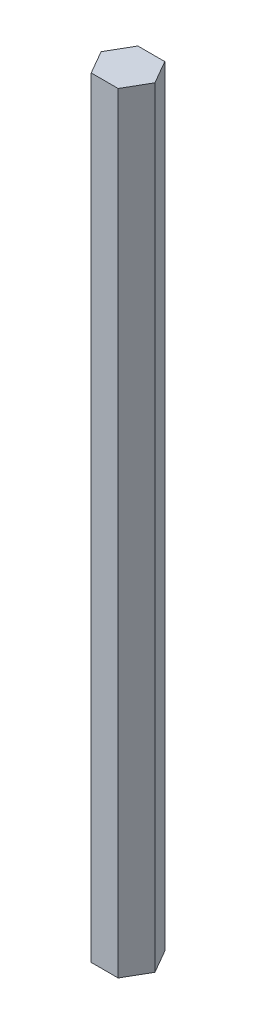
ISO-10303-21;
HEADER;
FILE_DESCRIPTION(('STEP AP214'),'2;1');
FILE_NAME('part.step','',(''),(''),'','','');
FILE_SCHEMA(('AUTOMOTIVE_DESIGN { 1 0 10303 214 1 1 1 1 }'));
ENDSEC;
DATA;
#1=APPLICATION_CONTEXT('core data for automotive mechanical design processes');
#2=APPLICATION_PROTOCOL_DEFINITION('international standard','automotive_design',2000,#1);
#3=PRODUCT_CONTEXT('',#1,'mechanical');
#4=PRODUCT('Part','Part','',(#3));
#5=PRODUCT_RELATED_PRODUCT_CATEGORY('part','',(#4));
#6=PRODUCT_DEFINITION_FORMATION('','',#4);
#7=PRODUCT_DEFINITION_CONTEXT('part definition',#1,'design');
#8=PRODUCT_DEFINITION('design','',#6,#7);
#9=PRODUCT_DEFINITION_SHAPE('','',#8);
#10=(LENGTH_UNIT() NAMED_UNIT(*) SI_UNIT(.MILLI.,.METRE.));
#11=(NAMED_UNIT(*) PLANE_ANGLE_UNIT() SI_UNIT($,.RADIAN.));
#12=(NAMED_UNIT(*) SI_UNIT($,.STERADIAN.) SOLID_ANGLE_UNIT());
#13=UNCERTAINTY_MEASURE_WITH_UNIT(LENGTH_MEASURE(1.E-05),#10,'distance_accuracy_value','');
#14=(GEOMETRIC_REPRESENTATION_CONTEXT(3) GLOBAL_UNCERTAINTY_ASSIGNED_CONTEXT((#13)) GLOBAL_UNIT_ASSIGNED_CONTEXT((#10,
#11,#12)) REPRESENTATION_CONTEXT('',''));
#15=CARTESIAN_POINT('',(0.,0.,0.));
#16=DIRECTION('',(0.,0.,1.));
#17=DIRECTION('',(1.,0.,0.));
#18=AXIS2_PLACEMENT_3D('',#15,#16,#17);
#19=CARTESIAN_POINT('',(4.195,-120.,0.));
#20=DIRECTION('',(0.866025403784438,0.,-0.5));
#21=DIRECTION('',(-0.5,0.,-0.866025403784439));
#22=AXIS2_PLACEMENT_3D('',#19,#20,#21);
#23=PLANE('',#22);
#24=DIRECTION('',(-0.5,0.,-0.866025403784439));
#25=VECTOR('',#24,1.);
#26=CARTESIAN_POINT('',(4.195,0.,0.));
#27=LINE('',#26,#25);
#28=CARTESIAN_POINT('',(4.195,0.,0.));
#29=VERTEX_POINT('',#28);
#30=CARTESIAN_POINT('',(2.0975,0.,-3.63297656887572));
#31=VERTEX_POINT('',#30);
#32=EDGE_CURVE('E130',#29,#31,#27,.T.);
#33=ORIENTED_EDGE('',*,*,#32,.F.);
#34=DIRECTION('',(0.,1.,0.));
#35=VECTOR('',#34,1.);
#36=CARTESIAN_POINT('',(4.195,-120.,0.));
#37=LINE('',#36,#35);
#38=CARTESIAN_POINT('',(4.195,-120.,0.));
#39=VERTEX_POINT('',#38);
#40=EDGE_CURVE('E11',#39,#29,#37,.T.);
#41=ORIENTED_EDGE('',*,*,#40,.F.);
#42=DIRECTION('',(-0.5,0.,-0.866025403784439));
#43=VECTOR('',#42,1.);
#44=CARTESIAN_POINT('',(4.195,-120.,0.));
#45=LINE('',#44,#43);
#46=CARTESIAN_POINT('',(2.0975,-120.,-3.63297656887572));
#47=VERTEX_POINT('',#46);
#48=EDGE_CURVE('E150',#39,#47,#45,.T.);
#49=ORIENTED_EDGE('',*,*,#48,.T.);
#50=DIRECTION('',(0.,1.,0.));
#51=VECTOR('',#50,1.);
#52=CARTESIAN_POINT('',(2.0975,-120.,-3.63297656887572));
#53=LINE('',#52,#51);
#54=EDGE_CURVE('E42',#47,#31,#53,.T.);
#55=ORIENTED_EDGE('',*,*,#54,.T.);
#56=EDGE_LOOP('',(#33,#41,#49,#55));
#57=FACE_BOUND('',#56,.T.);
#58=ADVANCED_FACE('F39',(#57),#23,.T.);
#59=CARTESIAN_POINT('',(2.0975,-120.,3.63297656887572));
#60=DIRECTION('',(0.866025403784438,0.,0.5));
#61=DIRECTION('',(0.5,0.,-0.866025403784439));
#62=AXIS2_PLACEMENT_3D('',#59,#60,#61);
#63=PLANE('',#62);
#64=DIRECTION('',(0.5,0.,-0.866025403784438));
#65=VECTOR('',#64,1.);
#66=CARTESIAN_POINT('',(2.0975,0.,3.63297656887572));
#67=LINE('',#66,#65);
#68=CARTESIAN_POINT('',(2.0975,0.,3.63297656887572));
#69=VERTEX_POINT('',#68);
#70=EDGE_CURVE('E147',#69,#29,#67,.T.);
#71=ORIENTED_EDGE('',*,*,#70,.F.);
#72=DIRECTION('',(0.,1.,0.));
#73=VECTOR('',#72,1.);
#74=CARTESIAN_POINT('',(2.0975,-120.,3.63297656887572));
#75=LINE('',#74,#73);
#76=CARTESIAN_POINT('',(2.0975,-120.,3.63297656887572));
#77=VERTEX_POINT('',#76);
#78=EDGE_CURVE('E49',#77,#69,#75,.T.);
#79=ORIENTED_EDGE('',*,*,#78,.F.);
#80=DIRECTION('',(0.5,0.,-0.866025403784438));
#81=VECTOR('',#80,1.);
#82=CARTESIAN_POINT('',(2.0975,-120.,3.63297656887572));
#83=LINE('',#82,#81);
#84=EDGE_CURVE('E116',#77,#39,#83,.T.);
#85=ORIENTED_EDGE('',*,*,#84,.T.);
#86=ORIENTED_EDGE('',*,*,#40,.T.);
#87=EDGE_LOOP('',(#71,#79,#85,#86));
#88=FACE_BOUND('',#87,.T.);
#89=ADVANCED_FACE('F162',(#88),#63,.T.);
#90=CARTESIAN_POINT('',(-2.0975,-120.,3.63297656887572));
#91=DIRECTION('',(0.,0.,1.));
#92=DIRECTION('',(1.,0.,0.));
#93=AXIS2_PLACEMENT_3D('',#90,#91,#92);
#94=PLANE('',#93);
#95=DIRECTION('',(1.,0.,0.));
#96=VECTOR('',#95,1.);
#97=CARTESIAN_POINT('',(-2.0975,0.,3.63297656887572));
#98=LINE('',#97,#96);
#99=CARTESIAN_POINT('',(-2.0975,0.,3.63297656887572));
#100=VERTEX_POINT('',#99);
#101=EDGE_CURVE('E102',#100,#69,#98,.T.);
#102=ORIENTED_EDGE('',*,*,#101,.F.);
#103=DIRECTION('',(0.,1.,0.));
#104=VECTOR('',#103,1.);
#105=CARTESIAN_POINT('',(-2.0975,-120.,3.63297656887572));
#106=LINE('',#105,#104);
#107=CARTESIAN_POINT('',(-2.0975,-120.,3.63297656887572));
#108=VERTEX_POINT('',#107);
#109=EDGE_CURVE('E97',#108,#100,#106,.T.);
#110=ORIENTED_EDGE('',*,*,#109,.F.);
#111=DIRECTION('',(1.,0.,0.));
#112=VECTOR('',#111,1.);
#113=CARTESIAN_POINT('',(-2.0975,-120.,3.63297656887572));
#114=LINE('',#113,#112);
#115=EDGE_CURVE('E100',#108,#77,#114,.T.);
#116=ORIENTED_EDGE('',*,*,#115,.T.);
#117=ORIENTED_EDGE('',*,*,#78,.T.);
#118=EDGE_LOOP('',(#102,#110,#116,#117));
#119=FACE_BOUND('',#118,.T.);
#120=ADVANCED_FACE('F99',(#119),#94,.T.);
#121=CARTESIAN_POINT('',(-4.195,-120.,0.));
#122=DIRECTION('',(-0.866025403784439,0.,0.5));
#123=DIRECTION('',(0.5,0.,0.866025403784439));
#124=AXIS2_PLACEMENT_3D('',#121,#122,#123);
#125=PLANE('',#124);
#126=DIRECTION('',(0.5,0.,0.866025403784439));
#127=VECTOR('',#126,1.);
#128=CARTESIAN_POINT('',(-4.195,0.,0.));
#129=LINE('',#128,#127);
#130=CARTESIAN_POINT('',(-4.195,0.,0.));
#131=VERTEX_POINT('',#130);
#132=EDGE_CURVE('E142',#131,#100,#129,.T.);
#133=ORIENTED_EDGE('',*,*,#132,.F.);
#134=DIRECTION('',(0.,1.,0.));
#135=VECTOR('',#134,1.);
#136=CARTESIAN_POINT('',(-4.195,-120.,0.));
#137=LINE('',#136,#135);
#138=CARTESIAN_POINT('',(-4.195,-120.,0.));
#139=VERTEX_POINT('',#138);
#140=EDGE_CURVE('E108',#139,#131,#137,.T.);
#141=ORIENTED_EDGE('',*,*,#140,.F.);
#142=DIRECTION('',(0.5,0.,0.866025403784439));
#143=VECTOR('',#142,1.);
#144=CARTESIAN_POINT('',(-4.195,-120.,0.));
#145=LINE('',#144,#143);
#146=EDGE_CURVE('E114',#139,#108,#145,.T.);
#147=ORIENTED_EDGE('',*,*,#146,.T.);
#148=ORIENTED_EDGE('',*,*,#109,.T.);
#149=EDGE_LOOP('',(#133,#141,#147,#148));
#150=FACE_BOUND('',#149,.T.);
#151=ADVANCED_FACE('F119',(#150),#125,.T.);
#152=CARTESIAN_POINT('',(-2.0975,-120.,-3.63297656887572));
#153=DIRECTION('',(-0.866025403784439,0.,-0.5));
#154=DIRECTION('',(-0.5,0.,0.866025403784439));
#155=AXIS2_PLACEMENT_3D('',#152,#153,#154);
#156=PLANE('',#155);
#157=DIRECTION('',(-0.5,0.,0.866025403784439));
#158=VECTOR('',#157,1.);
#159=CARTESIAN_POINT('',(-2.0975,0.,-3.63297656887572));
#160=LINE('',#159,#158);
#161=CARTESIAN_POINT('',(-2.0975,0.,-3.63297656887572));
#162=VERTEX_POINT('',#161);
#163=EDGE_CURVE('E138',#162,#131,#160,.T.);
#164=ORIENTED_EDGE('',*,*,#163,.F.);
#165=DIRECTION('',(0.,1.,0.));
#166=VECTOR('',#165,1.);
#167=CARTESIAN_POINT('',(-2.0975,-120.,-3.63297656887572));
#168=LINE('',#167,#166);
#169=CARTESIAN_POINT('',(-2.0975,-120.,-3.63297656887572));
#170=VERTEX_POINT('',#169);
#171=EDGE_CURVE('E155',#170,#162,#168,.T.);
#172=ORIENTED_EDGE('',*,*,#171,.F.);
#173=DIRECTION('',(-0.5,0.,0.866025403784439));
#174=VECTOR('',#173,1.);
#175=CARTESIAN_POINT('',(-2.0975,-120.,-3.63297656887572));
#176=LINE('',#175,#174);
#177=EDGE_CURVE('E121',#170,#139,#176,.T.);
#178=ORIENTED_EDGE('',*,*,#177,.T.);
#179=ORIENTED_EDGE('',*,*,#140,.T.);
#180=EDGE_LOOP('',(#164,#172,#178,#179));
#181=FACE_BOUND('',#180,.T.);
#182=ADVANCED_FACE('F175',(#181),#156,.T.);
#183=CARTESIAN_POINT('',(2.0975,-120.,-3.63297656887572));
#184=DIRECTION('',(0.,0.,-1.));
#185=DIRECTION('',(-1.,0.,0.));
#186=AXIS2_PLACEMENT_3D('',#183,#184,#185);
#187=PLANE('',#186);
#188=DIRECTION('',(-1.,0.,0.));
#189=VECTOR('',#188,1.);
#190=CARTESIAN_POINT('',(2.0975,0.,-3.63297656887572));
#191=LINE('',#190,#189);
#192=EDGE_CURVE('E134',#31,#162,#191,.T.);
#193=ORIENTED_EDGE('',*,*,#192,.F.);
#194=ORIENTED_EDGE('',*,*,#54,.F.);
#195=DIRECTION('',(-1.,0.,0.));
#196=VECTOR('',#195,1.);
#197=CARTESIAN_POINT('',(2.0975,-120.,-3.63297656887572));
#198=LINE('',#197,#196);
#199=EDGE_CURVE('E124',#47,#170,#198,.T.);
#200=ORIENTED_EDGE('',*,*,#199,.T.);
#201=ORIENTED_EDGE('',*,*,#171,.T.);
#202=EDGE_LOOP('',(#193,#194,#200,#201));
#203=FACE_BOUND('',#202,.T.);
#204=ADVANCED_FACE('F159',(#203),#187,.T.);
#205=CARTESIAN_POINT('',(0.,-120.,0.));
#206=DIRECTION('',(0.,1.,0.));
#207=DIRECTION('',(0.,0.,1.));
#208=AXIS2_PLACEMENT_3D('',#205,#206,#207);
#209=PLANE('',#208);
#210=ORIENTED_EDGE('',*,*,#48,.F.);
#211=ORIENTED_EDGE('',*,*,#84,.F.);
#212=ORIENTED_EDGE('',*,*,#115,.F.);
#213=ORIENTED_EDGE('',*,*,#146,.F.);
#214=ORIENTED_EDGE('',*,*,#177,.F.);
#215=ORIENTED_EDGE('',*,*,#199,.F.);
#216=EDGE_LOOP('',(#210,#211,#212,#213,#214,#215));
#217=FACE_BOUND('',#216,.T.);
#218=ADVANCED_FACE('F112',(#217),#209,.F.);
#219=CARTESIAN_POINT('',(0.,0.,0.));
#220=DIRECTION('',(0.,1.,0.));
#221=DIRECTION('',(0.,0.,1.));
#222=AXIS2_PLACEMENT_3D('',#219,#220,#221);
#223=PLANE('',#222);
#224=ORIENTED_EDGE('',*,*,#32,.T.);
#225=ORIENTED_EDGE('',*,*,#192,.T.);
#226=ORIENTED_EDGE('',*,*,#163,.T.);
#227=ORIENTED_EDGE('',*,*,#132,.T.);
#228=ORIENTED_EDGE('',*,*,#101,.T.);
#229=ORIENTED_EDGE('',*,*,#70,.T.);
#230=EDGE_LOOP('',(#224,#225,#226,#227,#228,#229));
#231=FACE_BOUND('',#230,.T.);
#232=ADVANCED_FACE('F161',(#231),#223,.T.);
#233=CLOSED_SHELL('',(#58,#89,#120,#151,#182,#204,#218,#232));
#234=MANIFOLD_SOLID_BREP('B2',#233);
#235=ADVANCED_BREP_SHAPE_REPRESENTATION('',(#18,#234),#14);
#236=SHAPE_DEFINITION_REPRESENTATION(#9,#235);
ENDSEC;
END-ISO-10303-21;
